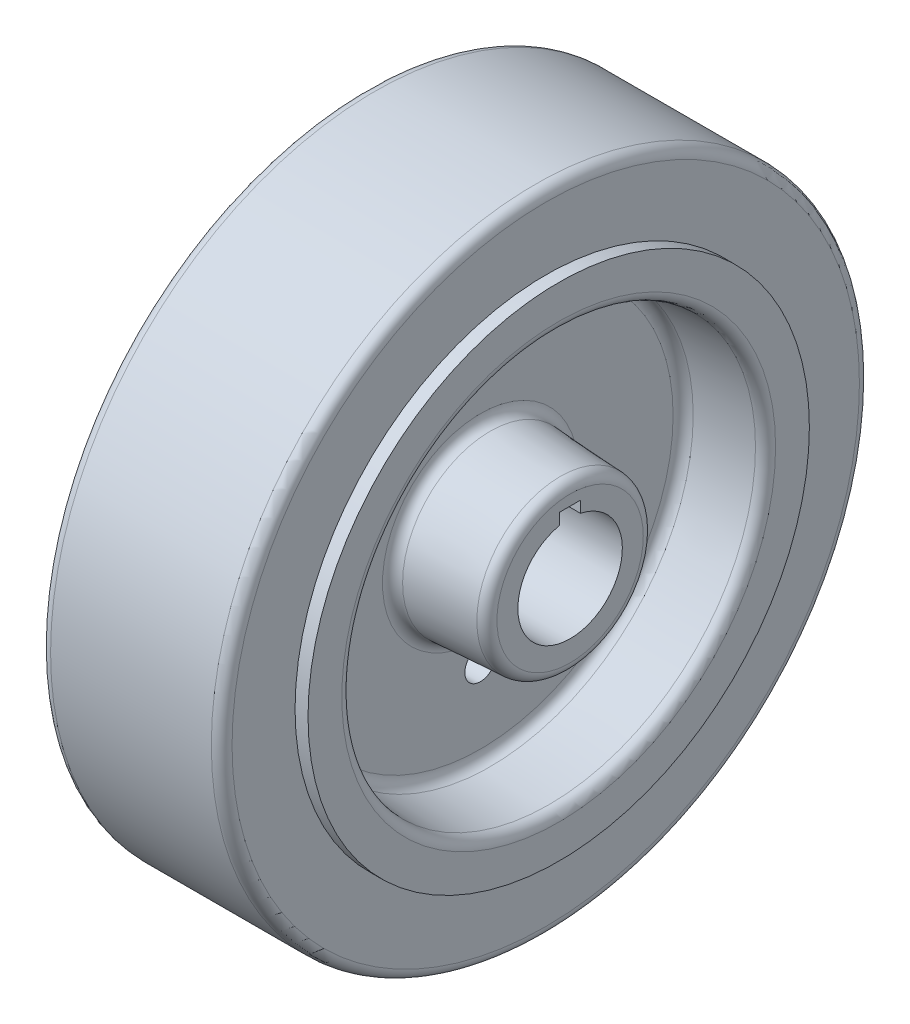
ISO-10303-21;
HEADER;
FILE_DESCRIPTION(('STEP AP214'),'2;1');
FILE_NAME('part.step','',(''),(''),'','','');
FILE_SCHEMA(('AUTOMOTIVE_DESIGN { 1 0 10303 214 1 1 1 1 }'));
ENDSEC;
DATA;
#1=APPLICATION_CONTEXT('core data for automotive mechanical design processes');
#2=APPLICATION_PROTOCOL_DEFINITION('international standard','automotive_design',2000,#1);
#3=PRODUCT_CONTEXT('',#1,'mechanical');
#4=PRODUCT('Part','Part','',(#3));
#5=PRODUCT_RELATED_PRODUCT_CATEGORY('part','',(#4));
#6=PRODUCT_DEFINITION_FORMATION('','',#4);
#7=PRODUCT_DEFINITION_CONTEXT('part definition',#1,'design');
#8=PRODUCT_DEFINITION('design','',#6,#7);
#9=PRODUCT_DEFINITION_SHAPE('','',#8);
#10=(LENGTH_UNIT() NAMED_UNIT(*) SI_UNIT(.MILLI.,.METRE.));
#11=(NAMED_UNIT(*) PLANE_ANGLE_UNIT() SI_UNIT($,.RADIAN.));
#12=(NAMED_UNIT(*) SI_UNIT($,.STERADIAN.) SOLID_ANGLE_UNIT());
#13=UNCERTAINTY_MEASURE_WITH_UNIT(LENGTH_MEASURE(1.E-05),#10,'distance_accuracy_value','');
#14=(GEOMETRIC_REPRESENTATION_CONTEXT(3) GLOBAL_UNCERTAINTY_ASSIGNED_CONTEXT((#13)) GLOBAL_UNIT_ASSIGNED_CONTEXT((#10,
#11,#12)) REPRESENTATION_CONTEXT('',''));
#15=CARTESIAN_POINT('',(0.,0.,0.));
#16=DIRECTION('',(0.,0.,1.));
#17=DIRECTION('',(1.,0.,0.));
#18=AXIS2_PLACEMENT_3D('',#15,#16,#17);
#19=CARTESIAN_POINT('',(17.5,-62.5,0.));
#20=DIRECTION('',(1.,0.,0.));
#21=DIRECTION('',(0.,0.,-1.));
#22=AXIS2_PLACEMENT_3D('',#19,#20,#21);
#23=PLANE('',#22);
#24=CARTESIAN_POINT('',(17.5,0.,0.));
#25=DIRECTION('',(1.,0.,0.));
#26=DIRECTION('',(0.,0.,-1.));
#27=AXIS2_PLACEMENT_3D('',#24,#25,#26);
#28=CIRCLE('',#27,60.5);
#29=CARTESIAN_POINT('',(17.5,0.,-60.5));
#30=VERTEX_POINT('',#29);
#31=EDGE_CURVE('E173',#30,#30,#28,.T.);
#32=ORIENTED_EDGE('',*,*,#31,.T.);
#33=EDGE_LOOP('',(#32));
#34=FACE_BOUND('',#33,.T.);
#35=CARTESIAN_POINT('',(17.5,0.,0.));
#36=DIRECTION('',(-1.,0.,0.));
#37=DIRECTION('',(0.,0.,1.));
#38=AXIS2_PLACEMENT_3D('',#35,#36,#37);
#39=CIRCLE('',#38,48.35);
#40=CARTESIAN_POINT('',(17.5,0.,48.35));
#41=VERTEX_POINT('',#40);
#42=EDGE_CURVE('E111',#41,#41,#39,.T.);
#43=ORIENTED_EDGE('',*,*,#42,.T.);
#44=EDGE_LOOP('',(#43));
#45=FACE_BOUND('',#44,.T.);
#46=ADVANCED_FACE('F39',(#34,#45),#23,.T.);
#47=CARTESIAN_POINT('',(0.,0.,0.));
#48=DIRECTION('',(-1.,0.,0.));
#49=DIRECTION('',(0.,0.,1.));
#50=AXIS2_PLACEMENT_3D('',#47,#48,#49);
#51=CYLINDRICAL_SURFACE('',#50,62.5);
#52=CARTESIAN_POINT('',(-15.5,0.,0.));
#53=DIRECTION('',(-1.,0.,0.));
#54=DIRECTION('',(0.,0.,1.));
#55=AXIS2_PLACEMENT_3D('',#52,#53,#54);
#56=CIRCLE('',#55,62.5);
#57=CARTESIAN_POINT('',(-15.5,0.,62.5));
#58=VERTEX_POINT('',#57);
#59=EDGE_CURVE('E170',#58,#58,#56,.F.);
#60=ORIENTED_EDGE('',*,*,#59,.T.);
#61=EDGE_LOOP('',(#60));
#62=FACE_BOUND('',#61,.T.);
#63=CARTESIAN_POINT('',(15.5,0.,0.));
#64=DIRECTION('',(1.,0.,0.));
#65=DIRECTION('',(0.,0.,-1.));
#66=AXIS2_PLACEMENT_3D('',#63,#64,#65);
#67=CIRCLE('',#66,62.5);
#68=CARTESIAN_POINT('',(15.5,0.,-62.5));
#69=VERTEX_POINT('',#68);
#70=EDGE_CURVE('E167',#69,#69,#67,.F.);
#71=ORIENTED_EDGE('',*,*,#70,.T.);
#72=EDGE_LOOP('',(#71));
#73=FACE_BOUND('',#72,.T.);
#74=ADVANCED_FACE('F202',(#62,#73),#51,.T.);
#75=CARTESIAN_POINT('',(-17.5,-62.5,0.));
#76=DIRECTION('',(-1.,0.,0.));
#77=DIRECTION('',(0.,0.,1.));
#78=AXIS2_PLACEMENT_3D('',#75,#76,#77);
#79=PLANE('',#78);
#80=CARTESIAN_POINT('',(-17.5,0.,0.));
#81=DIRECTION('',(-1.,0.,0.));
#82=DIRECTION('',(0.,0.,1.));
#83=AXIS2_PLACEMENT_3D('',#80,#81,#82);
#84=CIRCLE('',#83,60.5);
#85=CARTESIAN_POINT('',(-17.5,0.,60.5));
#86=VERTEX_POINT('',#85);
#87=EDGE_CURVE('E164',#86,#86,#84,.T.);
#88=ORIENTED_EDGE('',*,*,#87,.T.);
#89=EDGE_LOOP('',(#88));
#90=FACE_BOUND('',#89,.T.);
#91=CARTESIAN_POINT('',(-17.5,0.,0.));
#92=DIRECTION('',(-1.,0.,0.));
#93=DIRECTION('',(0.,0.,1.));
#94=AXIS2_PLACEMENT_3D('',#91,#92,#93);
#95=CIRCLE('',#94,48.35);
#96=CARTESIAN_POINT('',(-17.5,0.,48.35));
#97=VERTEX_POINT('',#96);
#98=EDGE_CURVE('E125',#97,#97,#95,.T.);
#99=ORIENTED_EDGE('',*,*,#98,.F.);
#100=EDGE_LOOP('',(#99));
#101=FACE_BOUND('',#100,.T.);
#102=ADVANCED_FACE('F208',(#90,#101),#79,.T.);
#103=CARTESIAN_POINT('',(0.,0.,0.));
#104=DIRECTION('',(-1.,0.,0.));
#105=DIRECTION('',(0.,0.,1.));
#106=AXIS2_PLACEMENT_3D('',#103,#104,#105);
#107=CYLINDRICAL_SURFACE('',#106,48.35);
#108=ORIENTED_EDGE('',*,*,#98,.T.);
#109=EDGE_LOOP('',(#108));
#110=FACE_BOUND('',#109,.T.);
#111=CARTESIAN_POINT('',(-20.,0.,0.));
#112=DIRECTION('',(-1.,0.,0.));
#113=DIRECTION('',(0.,0.,1.));
#114=AXIS2_PLACEMENT_3D('',#111,#112,#113);
#115=CIRCLE('',#114,48.35);
#116=CARTESIAN_POINT('',(-20.,0.,48.35));
#117=VERTEX_POINT('',#116);
#118=EDGE_CURVE('E122',#117,#117,#115,.T.);
#119=ORIENTED_EDGE('',*,*,#118,.F.);
#120=EDGE_LOOP('',(#119));
#121=FACE_BOUND('',#120,.T.);
#122=ADVANCED_FACE('F264',(#110,#121),#107,.T.);
#123=CARTESIAN_POINT('',(-20.,-48.35,0.));
#124=DIRECTION('',(-1.,0.,0.));
#125=DIRECTION('',(0.,0.,1.));
#126=AXIS2_PLACEMENT_3D('',#123,#124,#125);
#127=PLANE('',#126);
#128=CARTESIAN_POINT('',(-20.,0.,0.));
#129=DIRECTION('',(-1.,0.,0.));
#130=DIRECTION('',(0.,0.,1.));
#131=AXIS2_PLACEMENT_3D('',#128,#129,#130);
#132=CIRCLE('',#131,41.834344028326);
#133=CARTESIAN_POINT('',(-20.,0.,41.834344028326));
#134=VERTEX_POINT('',#133);
#135=EDGE_CURVE('E179',#134,#134,#132,.F.);
#136=ORIENTED_EDGE('',*,*,#135,.T.);
#137=EDGE_LOOP('',(#136));
#138=FACE_BOUND('',#137,.T.);
#139=ORIENTED_EDGE('',*,*,#118,.T.);
#140=EDGE_LOOP('',(#139));
#141=FACE_BOUND('',#140,.T.);
#142=ADVANCED_FACE('F254',(#138,#141),#127,.T.);
#143=CARTESIAN_POINT('',(-4.9,0.,0.));
#144=DIRECTION('',(-1.,0.,0.));
#145=DIRECTION('',(0.,0.,1.));
#146=AXIS2_PLACEMENT_3D('',#143,#144,#145);
#147=CONICAL_SURFACE('',#146,39.05,0.0595322200752487);
#148=CARTESIAN_POINT('',(-6.78100587647518,0.,0.));
#149=DIRECTION('',(-1.,0.,0.));
#150=DIRECTION('',(0.,0.,1.));
#151=AXIS2_PLACEMENT_3D('',#148,#149,#150);
#152=CIRCLE('',#151,39.1621129330349);
#153=CARTESIAN_POINT('',(-6.78100587647518,0.,39.1621129330349));
#154=VERTEX_POINT('',#153);
#155=EDGE_CURVE('E161',#154,#154,#152,.F.);
#156=ORIENTED_EDGE('',*,*,#155,.T.);
#157=EDGE_LOOP('',(#156));
#158=FACE_BOUND('',#157,.T.);
#159=CARTESIAN_POINT('',(-18.1189941235249,0.,0.));
#160=DIRECTION('',(1.,0.,0.));
#161=DIRECTION('',(0.,0.,-1.));
#162=AXIS2_PLACEMENT_3D('',#159,#160,#161);
#163=CIRCLE('',#162,39.8378870669651);
#164=CARTESIAN_POINT('',(-18.1189941235249,0.,-39.8378870669651));
#165=VERTEX_POINT('',#164);
#166=EDGE_CURVE('E158',#165,#165,#163,.F.);
#167=ORIENTED_EDGE('',*,*,#166,.T.);
#168=EDGE_LOOP('',(#167));
#169=FACE_BOUND('',#168,.T.);
#170=ADVANCED_FACE('F251',(#158,#169),#147,.F.);
#171=CARTESIAN_POINT('',(-4.9,-39.05,0.));
#172=DIRECTION('',(-1.,0.,0.));
#173=DIRECTION('',(0.,0.,1.));
#174=AXIS2_PLACEMENT_3D('',#171,#172,#173);
#175=PLANE('',#174);
#176=CARTESIAN_POINT('',(-4.9,-22.8910644094649,0.));
#177=DIRECTION('',(-1.,0.,0.));
#178=DIRECTION('',(0.,0.,1.));
#179=AXIS2_PLACEMENT_3D('',#176,#177,#178);
#180=CIRCLE('',#179,3.);
#181=CARTESIAN_POINT('',(-4.9,-22.8910644094649,-3.));
#182=VERTEX_POINT('',#181);
#183=EDGE_CURVE('E102',#182,#182,#180,.T.);
#184=ORIENTED_EDGE('',*,*,#183,.F.);
#185=EDGE_LOOP('',(#184));
#186=FACE_BOUND('',#185,.T.);
#187=CARTESIAN_POINT('',(-4.9,0.,0.));
#188=DIRECTION('',(-1.,0.,0.));
#189=DIRECTION('',(0.,0.,1.));
#190=AXIS2_PLACEMENT_3D('',#187,#188,#189);
#191=CIRCLE('',#190,18.8877315182009);
#192=CARTESIAN_POINT('',(-4.9,0.,18.8877315182009));
#193=VERTEX_POINT('',#192);
#194=EDGE_CURVE('E155',#193,#193,#191,.F.);
#195=ORIENTED_EDGE('',*,*,#194,.T.);
#196=EDGE_LOOP('',(#195));
#197=FACE_BOUND('',#196,.T.);
#198=CARTESIAN_POINT('',(-4.9,0.,0.));
#199=DIRECTION('',(-1.,0.,0.));
#200=DIRECTION('',(0.,0.,1.));
#201=AXIS2_PLACEMENT_3D('',#198,#199,#200);
#202=CIRCLE('',#201,37.165655971674);
#203=CARTESIAN_POINT('',(-4.9,0.,37.165655971674));
#204=VERTEX_POINT('',#203);
#205=EDGE_CURVE('E152',#204,#204,#202,.T.);
#206=ORIENTED_EDGE('',*,*,#205,.T.);
#207=EDGE_LOOP('',(#206));
#208=FACE_BOUND('',#207,.T.);
#209=ADVANCED_FACE('F253',(#186,#197,#208),#175,.T.);
#210=CARTESIAN_POINT('',(-22.2,0.,0.));
#211=DIRECTION('',(1.,0.,0.));
#212=DIRECTION('',(0.,0.,-1.));
#213=AXIS2_PLACEMENT_3D('',#210,#211,#212);
#214=CONICAL_SURFACE('',#213,16.,0.057739218525104);
#215=CARTESIAN_POINT('',(-6.78458571625803,0.,0.));
#216=DIRECTION('',(1.,0.,0.));
#217=DIRECTION('',(0.,0.,-1.));
#218=AXIS2_PLACEMENT_3D('',#215,#216,#217);
#219=CIRCLE('',#218,16.8910644094649);
#220=CARTESIAN_POINT('',(-6.78458571625803,0.,-16.8910644094649));
#221=VERTEX_POINT('',#220);
#222=EDGE_CURVE('E149',#221,#221,#219,.F.);
#223=ORIENTED_EDGE('',*,*,#222,.T.);
#224=EDGE_LOOP('',(#223));
#225=FACE_BOUND('',#224,.T.);
#226=CARTESIAN_POINT('',(-20.315414283742,0.,0.));
#227=DIRECTION('',(-1.,0.,0.));
#228=DIRECTION('',(0.,0.,1.));
#229=AXIS2_PLACEMENT_3D('',#226,#227,#228);
#230=CIRCLE('',#229,16.1089355905351);
#231=CARTESIAN_POINT('',(-20.315414283742,0.,16.1089355905351));
#232=VERTEX_POINT('',#231);
#233=EDGE_CURVE('E146',#232,#232,#230,.F.);
#234=ORIENTED_EDGE('',*,*,#233,.T.);
#235=EDGE_LOOP('',(#234));
#236=FACE_BOUND('',#235,.T.);
#237=ADVANCED_FACE('F261',(#225,#236),#214,.T.);
#238=CARTESIAN_POINT('',(-22.2,-16.,0.));
#239=DIRECTION('',(-1.,0.,0.));
#240=DIRECTION('',(0.,0.,1.));
#241=AXIS2_PLACEMENT_3D('',#238,#239,#240);
#242=PLANE('',#241);
#243=DIRECTION('',(0.,1.,0.));
#244=VECTOR('',#243,1.);
#245=CARTESIAN_POINT('',(-22.2,12.075,1.99999999999999));
#246=LINE('',#245,#244);
#247=CARTESIAN_POINT('',(-22.2,9.87449365790469,2.));
#248=VERTEX_POINT('',#247);
#249=CARTESIAN_POINT('',(-22.2,12.075,1.99999999999999));
#250=VERTEX_POINT('',#249);
#251=EDGE_CURVE('E97',#248,#250,#246,.T.);
#252=ORIENTED_EDGE('',*,*,#251,.F.);
#253=CARTESIAN_POINT('',(-22.2,0.,0.));
#254=DIRECTION('',(-1.,0.,0.));
#255=DIRECTION('',(0.,0.,1.));
#256=AXIS2_PLACEMENT_3D('',#253,#254,#255);
#257=CIRCLE('',#256,10.075);
#258=CARTESIAN_POINT('',(-22.2,9.87449365790469,-2.));
#259=VERTEX_POINT('',#258);
#260=EDGE_CURVE('E119',#259,#248,#257,.T.);
#261=ORIENTED_EDGE('',*,*,#260,.F.);
#262=DIRECTION('',(0.,-1.,0.));
#263=VECTOR('',#262,1.);
#264=CARTESIAN_POINT('',(-22.2,12.075,-2.00000000000001));
#265=LINE('',#264,#263);
#266=CARTESIAN_POINT('',(-22.2,12.075,-2.00000000000001));
#267=VERTEX_POINT('',#266);
#268=EDGE_CURVE('E99',#267,#259,#265,.T.);
#269=ORIENTED_EDGE('',*,*,#268,.F.);
#270=DIRECTION('',(0.,0.,-1.));
#271=VECTOR('',#270,1.);
#272=CARTESIAN_POINT('',(-22.2,12.075,-2.00000000000001));
#273=LINE('',#272,#271);
#274=EDGE_CURVE('E85',#250,#267,#273,.T.);
#275=ORIENTED_EDGE('',*,*,#274,.F.);
#276=EDGE_LOOP('',(#252,#261,#269,#275));
#277=FACE_BOUND('',#276,.T.);
#278=CARTESIAN_POINT('',(-22.2,0.,0.));
#279=DIRECTION('',(-1.,0.,0.));
#280=DIRECTION('',(0.,0.,1.));
#281=AXIS2_PLACEMENT_3D('',#278,#279,#280);
#282=CIRCLE('',#281,14.1122684817991);
#283=CARTESIAN_POINT('',(-22.2,0.,14.1122684817991));
#284=VERTEX_POINT('',#283);
#285=EDGE_CURVE('E47',#284,#284,#282,.T.);
#286=ORIENTED_EDGE('',*,*,#285,.T.);
#287=EDGE_LOOP('',(#286));
#288=FACE_BOUND('',#287,.T.);
#289=ADVANCED_FACE('F187',(#277,#288),#242,.T.);
#290=CARTESIAN_POINT('',(0.,0.,0.));
#291=DIRECTION('',(-1.,0.,0.));
#292=DIRECTION('',(0.,0.,1.));
#293=AXIS2_PLACEMENT_3D('',#290,#291,#292);
#294=CYLINDRICAL_SURFACE('',#293,10.075);
#295=DIRECTION('',(-1.,0.,0.));
#296=VECTOR('',#295,1.);
#297=CARTESIAN_POINT('',(0.,9.87449365790469,2.));
#298=LINE('',#297,#296);
#299=CARTESIAN_POINT('',(22.2,9.87449365790469,2.));
#300=VERTEX_POINT('',#299);
#301=EDGE_CURVE('E109',#300,#248,#298,.T.);
#302=ORIENTED_EDGE('',*,*,#301,.F.);
#303=CARTESIAN_POINT('',(22.2,0.,0.));
#304=DIRECTION('',(-1.,0.,0.));
#305=DIRECTION('',(0.,0.,1.));
#306=AXIS2_PLACEMENT_3D('',#303,#304,#305);
#307=CIRCLE('',#306,10.075);
#308=CARTESIAN_POINT('',(22.2,9.87449365790469,-2.));
#309=VERTEX_POINT('',#308);
#310=EDGE_CURVE('E117',#309,#300,#307,.T.);
#311=ORIENTED_EDGE('',*,*,#310,.F.);
#312=DIRECTION('',(-1.,0.,0.));
#313=VECTOR('',#312,1.);
#314=CARTESIAN_POINT('',(0.,9.87449365790469,-2.));
#315=LINE('',#314,#313);
#316=EDGE_CURVE('E54',#259,#309,#315,.F.);
#317=ORIENTED_EDGE('',*,*,#316,.F.);
#318=ORIENTED_EDGE('',*,*,#260,.T.);
#319=EDGE_LOOP('',(#302,#311,#317,#318));
#320=FACE_BOUND('',#319,.T.);
#321=ADVANCED_FACE('F426',(#320),#294,.F.);
#322=CARTESIAN_POINT('',(22.2,-16.,0.));
#323=DIRECTION('',(1.,0.,0.));
#324=DIRECTION('',(0.,0.,-1.));
#325=AXIS2_PLACEMENT_3D('',#322,#323,#324);
#326=PLANE('',#325);
#327=DIRECTION('',(0.,-1.,0.));
#328=VECTOR('',#327,1.);
#329=CARTESIAN_POINT('',(22.2,-16.,2.00000000000006));
#330=LINE('',#329,#328);
#331=CARTESIAN_POINT('',(22.2,12.075,1.99999999999999));
#332=VERTEX_POINT('',#331);
#333=EDGE_CURVE('E11',#332,#300,#330,.T.);
#334=ORIENTED_EDGE('',*,*,#333,.F.);
#335=DIRECTION('',(0.,0.,-1.));
#336=VECTOR('',#335,1.);
#337=CARTESIAN_POINT('',(22.2,12.075,-2.00000000000001));
#338=LINE('',#337,#336);
#339=CARTESIAN_POINT('',(22.2,12.075,-2.00000000000001));
#340=VERTEX_POINT('',#339);
#341=EDGE_CURVE('E83',#332,#340,#338,.T.);
#342=ORIENTED_EDGE('',*,*,#341,.T.);
#343=DIRECTION('',(0.,-1.,0.));
#344=VECTOR('',#343,1.);
#345=CARTESIAN_POINT('',(22.2,12.075,-2.00000000000001));
#346=LINE('',#345,#344);
#347=EDGE_CURVE('E88',#340,#309,#346,.T.);
#348=ORIENTED_EDGE('',*,*,#347,.T.);
#349=ORIENTED_EDGE('',*,*,#310,.T.);
#350=EDGE_LOOP('',(#334,#342,#348,#349));
#351=FACE_BOUND('',#350,.T.);
#352=CARTESIAN_POINT('',(22.2,0.,0.));
#353=DIRECTION('',(1.,0.,0.));
#354=DIRECTION('',(0.,0.,-1.));
#355=AXIS2_PLACEMENT_3D('',#352,#353,#354);
#356=CIRCLE('',#355,14.1122684817991);
#357=CARTESIAN_POINT('',(22.2,0.,-14.1122684817991));
#358=VERTEX_POINT('',#357);
#359=EDGE_CURVE('E182',#358,#358,#356,.T.);
#360=ORIENTED_EDGE('',*,*,#359,.T.);
#361=EDGE_LOOP('',(#360));
#362=FACE_BOUND('',#361,.T.);
#363=ADVANCED_FACE('F95',(#351,#362),#326,.T.);
#364=CARTESIAN_POINT('',(4.9,0.,0.));
#365=DIRECTION('',(-1.,0.,0.));
#366=DIRECTION('',(0.,0.,1.));
#367=AXIS2_PLACEMENT_3D('',#364,#365,#366);
#368=CONICAL_SURFACE('',#367,17.,0.057739218525104);
#369=CARTESIAN_POINT('',(6.78458571625803,0.,0.));
#370=DIRECTION('',(-1.,0.,0.));
#371=DIRECTION('',(0.,0.,1.));
#372=AXIS2_PLACEMENT_3D('',#369,#370,#371);
#373=CIRCLE('',#372,16.8910644094649);
#374=CARTESIAN_POINT('',(6.78458571625803,0.,16.8910644094649));
#375=VERTEX_POINT('',#374);
#376=EDGE_CURVE('E143',#375,#375,#373,.F.);
#377=ORIENTED_EDGE('',*,*,#376,.T.);
#378=EDGE_LOOP('',(#377));
#379=FACE_BOUND('',#378,.T.);
#380=CARTESIAN_POINT('',(20.315414283742,0.,0.));
#381=DIRECTION('',(1.,0.,0.));
#382=DIRECTION('',(0.,0.,-1.));
#383=AXIS2_PLACEMENT_3D('',#380,#381,#382);
#384=CIRCLE('',#383,16.1089355905352);
#385=CARTESIAN_POINT('',(20.315414283742,0.,-16.1089355905352));
#386=VERTEX_POINT('',#385);
#387=EDGE_CURVE('E140',#386,#386,#384,.F.);
#388=ORIENTED_EDGE('',*,*,#387,.T.);
#389=EDGE_LOOP('',(#388));
#390=FACE_BOUND('',#389,.T.);
#391=ADVANCED_FACE('F321',(#379,#390),#368,.T.);
#392=CARTESIAN_POINT('',(4.9,-39.05,0.));
#393=DIRECTION('',(1.,0.,0.));
#394=DIRECTION('',(0.,0.,-1.));
#395=AXIS2_PLACEMENT_3D('',#392,#393,#394);
#396=PLANE('',#395);
#397=CARTESIAN_POINT('',(4.9,-22.8910644094649,0.));
#398=DIRECTION('',(1.,0.,0.));
#399=DIRECTION('',(0.,0.,-1.));
#400=AXIS2_PLACEMENT_3D('',#397,#398,#399);
#401=CIRCLE('',#400,3.);
#402=CARTESIAN_POINT('',(4.9,-22.8910644094649,-3.));
#403=VERTEX_POINT('',#402);
#404=EDGE_CURVE('E530',#403,#403,#401,.T.);
#405=ORIENTED_EDGE('',*,*,#404,.F.);
#406=EDGE_LOOP('',(#405));
#407=FACE_BOUND('',#406,.T.);
#408=CARTESIAN_POINT('',(4.9,0.,0.));
#409=DIRECTION('',(1.,0.,0.));
#410=DIRECTION('',(0.,0.,-1.));
#411=AXIS2_PLACEMENT_3D('',#408,#409,#410);
#412=CIRCLE('',#411,37.165655971674);
#413=CARTESIAN_POINT('',(4.9,0.,-37.165655971674));
#414=VERTEX_POINT('',#413);
#415=EDGE_CURVE('E137',#414,#414,#412,.T.);
#416=ORIENTED_EDGE('',*,*,#415,.T.);
#417=EDGE_LOOP('',(#416));
#418=FACE_BOUND('',#417,.T.);
#419=CARTESIAN_POINT('',(4.9,0.,0.));
#420=DIRECTION('',(1.,0.,0.));
#421=DIRECTION('',(0.,0.,-1.));
#422=AXIS2_PLACEMENT_3D('',#419,#420,#421);
#423=CIRCLE('',#422,18.8877315182009);
#424=CARTESIAN_POINT('',(4.9,0.,-18.8877315182009));
#425=VERTEX_POINT('',#424);
#426=EDGE_CURVE('E134',#425,#425,#423,.F.);
#427=ORIENTED_EDGE('',*,*,#426,.T.);
#428=EDGE_LOOP('',(#427));
#429=FACE_BOUND('',#428,.T.);
#430=ADVANCED_FACE('F326',(#407,#418,#429),#396,.T.);
#431=CARTESIAN_POINT('',(20.,0.,0.));
#432=DIRECTION('',(1.,0.,0.));
#433=DIRECTION('',(0.,0.,-1.));
#434=AXIS2_PLACEMENT_3D('',#431,#432,#433);
#435=CONICAL_SURFACE('',#434,39.95,0.0595322200752487);
#436=CARTESIAN_POINT('',(6.78100587647518,0.,0.));
#437=DIRECTION('',(1.,0.,0.));
#438=DIRECTION('',(0.,0.,-1.));
#439=AXIS2_PLACEMENT_3D('',#436,#437,#438);
#440=CIRCLE('',#439,39.1621129330349);
#441=CARTESIAN_POINT('',(6.78100587647518,0.,-39.1621129330349));
#442=VERTEX_POINT('',#441);
#443=EDGE_CURVE('E131',#442,#442,#440,.F.);
#444=ORIENTED_EDGE('',*,*,#443,.T.);
#445=EDGE_LOOP('',(#444));
#446=FACE_BOUND('',#445,.T.);
#447=CARTESIAN_POINT('',(18.1189941235249,0.,0.));
#448=DIRECTION('',(-1.,0.,0.));
#449=DIRECTION('',(0.,0.,1.));
#450=AXIS2_PLACEMENT_3D('',#447,#448,#449);
#451=CIRCLE('',#450,39.8378870669651);
#452=CARTESIAN_POINT('',(18.1189941235249,0.,39.8378870669651));
#453=VERTEX_POINT('',#452);
#454=EDGE_CURVE('E128',#453,#453,#451,.F.);
#455=ORIENTED_EDGE('',*,*,#454,.T.);
#456=EDGE_LOOP('',(#455));
#457=FACE_BOUND('',#456,.T.);
#458=ADVANCED_FACE('F335',(#446,#457),#435,.F.);
#459=CARTESIAN_POINT('',(20.,-48.35,0.));
#460=DIRECTION('',(1.,0.,0.));
#461=DIRECTION('',(0.,0.,-1.));
#462=AXIS2_PLACEMENT_3D('',#459,#460,#461);
#463=PLANE('',#462);
#464=CARTESIAN_POINT('',(20.,0.,0.));
#465=DIRECTION('',(1.,0.,0.));
#466=DIRECTION('',(0.,0.,-1.));
#467=AXIS2_PLACEMENT_3D('',#464,#465,#466);
#468=CIRCLE('',#467,41.834344028326);
#469=CARTESIAN_POINT('',(20.,0.,-41.834344028326));
#470=VERTEX_POINT('',#469);
#471=EDGE_CURVE('E176',#470,#470,#468,.F.);
#472=ORIENTED_EDGE('',*,*,#471,.T.);
#473=EDGE_LOOP('',(#472));
#474=FACE_BOUND('',#473,.T.);
#475=CARTESIAN_POINT('',(20.,0.,0.));
#476=DIRECTION('',(-1.,0.,0.));
#477=DIRECTION('',(0.,0.,1.));
#478=AXIS2_PLACEMENT_3D('',#475,#476,#477);
#479=CIRCLE('',#478,48.35);
#480=CARTESIAN_POINT('',(20.,0.,48.35));
#481=VERTEX_POINT('',#480);
#482=EDGE_CURVE('E114',#481,#481,#479,.T.);
#483=ORIENTED_EDGE('',*,*,#482,.F.);
#484=EDGE_LOOP('',(#483));
#485=FACE_BOUND('',#484,.T.);
#486=ADVANCED_FACE('F340',(#474,#485),#463,.T.);
#487=CARTESIAN_POINT('',(0.,0.,0.));
#488=DIRECTION('',(-1.,0.,0.));
#489=DIRECTION('',(0.,0.,1.));
#490=AXIS2_PLACEMENT_3D('',#487,#488,#489);
#491=CYLINDRICAL_SURFACE('',#490,48.35);
#492=ORIENTED_EDGE('',*,*,#482,.T.);
#493=EDGE_LOOP('',(#492));
#494=FACE_BOUND('',#493,.T.);
#495=ORIENTED_EDGE('',*,*,#42,.F.);
#496=EDGE_LOOP('',(#495));
#497=FACE_BOUND('',#496,.T.);
#498=ADVANCED_FACE('F218',(#494,#497),#491,.T.);
#499=CARTESIAN_POINT('',(6.9,0.,0.));
#500=DIRECTION('',(1.,0.,0.));
#501=DIRECTION('',(0.,0.,-1.));
#502=AXIS2_PLACEMENT_3D('',#499,#500,#501);
#503=TOROIDAL_SURFACE('',#502,37.165655971674,2.);
#504=ORIENTED_EDGE('',*,*,#415,.F.);
#505=EDGE_LOOP('',(#504));
#506=FACE_BOUND('',#505,.T.);
#507=ORIENTED_EDGE('',*,*,#443,.F.);
#508=EDGE_LOOP('',(#507));
#509=FACE_BOUND('',#508,.T.);
#510=ADVANCED_FACE('F214',(#506,#509),#503,.F.);
#511=CARTESIAN_POINT('',(6.9,0.,0.));
#512=DIRECTION('',(1.,0.,0.));
#513=DIRECTION('',(0.,0.,-1.));
#514=AXIS2_PLACEMENT_3D('',#511,#512,#513);
#515=TOROIDAL_SURFACE('',#514,18.8877315182009,2.);
#516=ORIENTED_EDGE('',*,*,#376,.F.);
#517=EDGE_LOOP('',(#516));
#518=FACE_BOUND('',#517,.T.);
#519=ORIENTED_EDGE('',*,*,#426,.F.);
#520=EDGE_LOOP('',(#519));
#521=FACE_BOUND('',#520,.T.);
#522=ADVANCED_FACE('F217',(#518,#521),#515,.F.);
#523=CARTESIAN_POINT('',(-6.9,0.,0.));
#524=DIRECTION('',(-1.,0.,0.));
#525=DIRECTION('',(0.,0.,1.));
#526=AXIS2_PLACEMENT_3D('',#523,#524,#525);
#527=TOROIDAL_SURFACE('',#526,18.8877315182009,2.);
#528=ORIENTED_EDGE('',*,*,#194,.F.);
#529=EDGE_LOOP('',(#528));
#530=FACE_BOUND('',#529,.T.);
#531=ORIENTED_EDGE('',*,*,#222,.F.);
#532=EDGE_LOOP('',(#531));
#533=FACE_BOUND('',#532,.T.);
#534=ADVANCED_FACE('F222',(#530,#533),#527,.F.);
#535=CARTESIAN_POINT('',(-6.9,0.,0.));
#536=DIRECTION('',(-1.,0.,0.));
#537=DIRECTION('',(0.,0.,1.));
#538=AXIS2_PLACEMENT_3D('',#535,#536,#537);
#539=TOROIDAL_SURFACE('',#538,37.165655971674,2.);
#540=ORIENTED_EDGE('',*,*,#155,.F.);
#541=EDGE_LOOP('',(#540));
#542=FACE_BOUND('',#541,.T.);
#543=ORIENTED_EDGE('',*,*,#205,.F.);
#544=EDGE_LOOP('',(#543));
#545=FACE_BOUND('',#544,.T.);
#546=ADVANCED_FACE('F226',(#542,#545),#539,.F.);
#547=CARTESIAN_POINT('',(-15.5,0.,0.));
#548=DIRECTION('',(-1.,0.,0.));
#549=DIRECTION('',(0.,0.,1.));
#550=AXIS2_PLACEMENT_3D('',#547,#548,#549);
#551=TOROIDAL_SURFACE('',#550,60.5,2.);
#552=ORIENTED_EDGE('',*,*,#59,.F.);
#553=EDGE_LOOP('',(#552));
#554=FACE_BOUND('',#553,.T.);
#555=ORIENTED_EDGE('',*,*,#87,.F.);
#556=EDGE_LOOP('',(#555));
#557=FACE_BOUND('',#556,.T.);
#558=ADVANCED_FACE('F230',(#554,#557),#551,.T.);
#559=CARTESIAN_POINT('',(15.5,0.,0.));
#560=DIRECTION('',(1.,0.,0.));
#561=DIRECTION('',(0.,0.,-1.));
#562=AXIS2_PLACEMENT_3D('',#559,#560,#561);
#563=TOROIDAL_SURFACE('',#562,60.5,2.);
#564=ORIENTED_EDGE('',*,*,#31,.F.);
#565=EDGE_LOOP('',(#564));
#566=FACE_BOUND('',#565,.T.);
#567=ORIENTED_EDGE('',*,*,#70,.F.);
#568=EDGE_LOOP('',(#567));
#569=FACE_BOUND('',#568,.T.);
#570=ADVANCED_FACE('F234',(#566,#569),#563,.T.);
#571=CARTESIAN_POINT('',(18.,0.,0.));
#572=DIRECTION('',(1.,0.,0.));
#573=DIRECTION('',(0.,0.,-1.));
#574=AXIS2_PLACEMENT_3D('',#571,#572,#573);
#575=TOROIDAL_SURFACE('',#574,41.834344028326,2.);
#576=ORIENTED_EDGE('',*,*,#454,.F.);
#577=EDGE_LOOP('',(#576));
#578=FACE_BOUND('',#577,.T.);
#579=ORIENTED_EDGE('',*,*,#471,.F.);
#580=EDGE_LOOP('',(#579));
#581=FACE_BOUND('',#580,.T.);
#582=ADVANCED_FACE('F238',(#578,#581),#575,.T.);
#583=CARTESIAN_POINT('',(-18.,0.,0.));
#584=DIRECTION('',(-1.,0.,0.));
#585=DIRECTION('',(0.,0.,1.));
#586=AXIS2_PLACEMENT_3D('',#583,#584,#585);
#587=TOROIDAL_SURFACE('',#586,41.834344028326,2.);
#588=ORIENTED_EDGE('',*,*,#135,.F.);
#589=EDGE_LOOP('',(#588));
#590=FACE_BOUND('',#589,.T.);
#591=ORIENTED_EDGE('',*,*,#166,.F.);
#592=EDGE_LOOP('',(#591));
#593=FACE_BOUND('',#592,.T.);
#594=ADVANCED_FACE('F198',(#590,#593),#587,.T.);
#595=CARTESIAN_POINT('',(20.2,0.,0.));
#596=DIRECTION('',(1.,0.,0.));
#597=DIRECTION('',(0.,0.,-1.));
#598=AXIS2_PLACEMENT_3D('',#595,#596,#597);
#599=TOROIDAL_SURFACE('',#598,14.1122684817991,2.);
#600=ORIENTED_EDGE('',*,*,#359,.F.);
#601=EDGE_LOOP('',(#600));
#602=FACE_BOUND('',#601,.T.);
#603=ORIENTED_EDGE('',*,*,#387,.F.);
#604=EDGE_LOOP('',(#603));
#605=FACE_BOUND('',#604,.T.);
#606=ADVANCED_FACE('F190',(#602,#605),#599,.T.);
#607=CARTESIAN_POINT('',(-20.2,0.,0.));
#608=DIRECTION('',(-1.,0.,0.));
#609=DIRECTION('',(0.,0.,1.));
#610=AXIS2_PLACEMENT_3D('',#607,#608,#609);
#611=TOROIDAL_SURFACE('',#610,14.1122684817991,2.);
#612=ORIENTED_EDGE('',*,*,#233,.F.);
#613=EDGE_LOOP('',(#612));
#614=FACE_BOUND('',#613,.T.);
#615=ORIENTED_EDGE('',*,*,#285,.F.);
#616=EDGE_LOOP('',(#615));
#617=FACE_BOUND('',#616,.T.);
#618=ADVANCED_FACE('F41',(#614,#617),#611,.T.);
#619=CARTESIAN_POINT('',(22.2,12.075,-2.00000000000001));
#620=DIRECTION('',(0.,1.,0.));
#621=DIRECTION('',(0.,0.,1.));
#622=AXIS2_PLACEMENT_3D('',#619,#620,#621);
#623=PLANE('',#622);
#624=ORIENTED_EDGE('',*,*,#274,.T.);
#625=DIRECTION('',(-1.,0.,0.));
#626=VECTOR('',#625,1.);
#627=CARTESIAN_POINT('',(22.2,12.075,-2.00000000000001));
#628=LINE('',#627,#626);
#629=EDGE_CURVE('E79',#340,#267,#628,.T.);
#630=ORIENTED_EDGE('',*,*,#629,.F.);
#631=ORIENTED_EDGE('',*,*,#341,.F.);
#632=DIRECTION('',(-1.,0.,0.));
#633=VECTOR('',#632,1.);
#634=CARTESIAN_POINT('',(22.2,12.075,1.99999999999999));
#635=LINE('',#634,#633);
#636=EDGE_CURVE('E87',#332,#250,#635,.T.);
#637=ORIENTED_EDGE('',*,*,#636,.T.);
#638=EDGE_LOOP('',(#624,#630,#631,#637));
#639=FACE_BOUND('',#638,.T.);
#640=ADVANCED_FACE('F80',(#639),#623,.F.);
#641=CARTESIAN_POINT('',(22.2,12.075,1.99999999999999));
#642=DIRECTION('',(0.,0.,1.));
#643=DIRECTION('',(0.,-1.,0.));
#644=AXIS2_PLACEMENT_3D('',#641,#642,#643);
#645=PLANE('',#644);
#646=ORIENTED_EDGE('',*,*,#301,.T.);
#647=ORIENTED_EDGE('',*,*,#251,.T.);
#648=ORIENTED_EDGE('',*,*,#636,.F.);
#649=ORIENTED_EDGE('',*,*,#333,.T.);
#650=EDGE_LOOP('',(#646,#647,#648,#649));
#651=FACE_BOUND('',#650,.T.);
#652=ADVANCED_FACE('F196',(#651),#645,.F.);
#653=CARTESIAN_POINT('',(22.2,12.075,-2.00000000000001));
#654=DIRECTION('',(0.,0.,-1.));
#655=DIRECTION('',(0.,1.,0.));
#656=AXIS2_PLACEMENT_3D('',#653,#654,#655);
#657=PLANE('',#656);
#658=ORIENTED_EDGE('',*,*,#316,.T.);
#659=ORIENTED_EDGE('',*,*,#347,.F.);
#660=ORIENTED_EDGE('',*,*,#629,.T.);
#661=ORIENTED_EDGE('',*,*,#268,.T.);
#662=EDGE_LOOP('',(#658,#659,#660,#661));
#663=FACE_BOUND('',#662,.T.);
#664=ADVANCED_FACE('F90',(#663),#657,.F.);
#665=CARTESIAN_POINT('',(-22.2,-22.8910644094649,0.));
#666=DIRECTION('',(1.,0.,0.));
#667=DIRECTION('',(0.,0.,-1.));
#668=AXIS2_PLACEMENT_3D('',#665,#666,#667);
#669=CYLINDRICAL_SURFACE('',#668,3.);
#670=CARTESIAN_POINT('',(-4.9,-22.8910644094649,-3.));
#671=CARTESIAN_POINT('',(-4.79791666666667,-22.8910644094649,-3.));
#672=CARTESIAN_POINT('',(-4.69583333333333,-22.8910644094649,-3.));
#673=CARTESIAN_POINT('',(-4.49166666666667,-22.8910644094649,-3.));
#674=CARTESIAN_POINT('',(-4.38958333333333,-22.8910644094649,-3.));
#675=CARTESIAN_POINT('',(-4.18541666666667,-22.8910644094649,-3.));
#676=CARTESIAN_POINT('',(-4.08333333333333,-22.8910644094649,-3.));
#677=CARTESIAN_POINT('',(-3.87916666666667,-22.8910644094649,-3.));
#678=CARTESIAN_POINT('',(-3.77708333333333,-22.8910644094649,-3.));
#679=CARTESIAN_POINT('',(-3.57291666666667,-22.8910644094649,-3.));
#680=CARTESIAN_POINT('',(-3.47083333333333,-22.8910644094649,-3.));
#681=CARTESIAN_POINT('',(-3.26666666666667,-22.8910644094649,-3.));
#682=CARTESIAN_POINT('',(-3.16458333333334,-22.8910644094649,-3.));
#683=CARTESIAN_POINT('',(-2.96041666666667,-22.8910644094649,-3.));
#684=CARTESIAN_POINT('',(-2.85833333333334,-22.8910644094649,-3.));
#685=CARTESIAN_POINT('',(-2.65416666666667,-22.8910644094649,-3.));
#686=CARTESIAN_POINT('',(-2.55208333333333,-22.8910644094649,-3.));
#687=CARTESIAN_POINT('',(-2.34791666666667,-22.8910644094649,-3.));
#688=CARTESIAN_POINT('',(-2.24583333333333,-22.8910644094649,-3.));
#689=CARTESIAN_POINT('',(-2.04166666666667,-22.8910644094649,-3.));
#690=CARTESIAN_POINT('',(-1.93958333333333,-22.8910644094649,-3.));
#691=CARTESIAN_POINT('',(-1.73541666666667,-22.8910644094649,-3.));
#692=CARTESIAN_POINT('',(-1.63333333333333,-22.8910644094649,-3.));
#693=CARTESIAN_POINT('',(-1.42916666666667,-22.8910644094649,-3.));
#694=CARTESIAN_POINT('',(-1.32708333333333,-22.8910644094649,-3.));
#695=CARTESIAN_POINT('',(-1.12291666666667,-22.8910644094649,-3.));
#696=CARTESIAN_POINT('',(-1.02083333333333,-22.8910644094649,-3.));
#697=CARTESIAN_POINT('',(-0.816666666666667,-22.8910644094649,-3.));
#698=CARTESIAN_POINT('',(-0.714583333333334,-22.8910644094649,-3.));
#699=CARTESIAN_POINT('',(-0.510416666666668,-22.8910644094649,-3.));
#700=CARTESIAN_POINT('',(-0.408333333333335,-22.8910644094649,-3.));
#701=CARTESIAN_POINT('',(-0.204166666666667,-22.8910644094649,-3.));
#702=CARTESIAN_POINT('',(-0.102083333333334,-22.8910644094649,-3.));
#703=CARTESIAN_POINT('',(0.102083333333334,-22.8910644094649,-3.));
#704=CARTESIAN_POINT('',(0.204166666666667,-22.8910644094649,-3.));
#705=CARTESIAN_POINT('',(0.408333333333335,-22.8910644094649,-3.));
#706=CARTESIAN_POINT('',(0.510416666666668,-22.8910644094649,-3.));
#707=CARTESIAN_POINT('',(0.714583333333334,-22.8910644094649,-3.));
#708=CARTESIAN_POINT('',(0.816666666666667,-22.8910644094649,-3.));
#709=CARTESIAN_POINT('',(1.02083333333333,-22.8910644094649,-3.));
#710=CARTESIAN_POINT('',(1.12291666666667,-22.8910644094649,-3.));
#711=CARTESIAN_POINT('',(1.32708333333333,-22.8910644094649,-3.));
#712=CARTESIAN_POINT('',(1.42916666666667,-22.8910644094649,-3.));
#713=CARTESIAN_POINT('',(1.63333333333333,-22.8910644094649,-3.));
#714=CARTESIAN_POINT('',(1.73541666666667,-22.8910644094649,-3.));
#715=CARTESIAN_POINT('',(1.93958333333333,-22.8910644094649,-3.));
#716=CARTESIAN_POINT('',(2.04166666666667,-22.8910644094649,-3.));
#717=CARTESIAN_POINT('',(2.24583333333333,-22.8910644094649,-3.));
#718=CARTESIAN_POINT('',(2.34791666666667,-22.8910644094649,-3.));
#719=CARTESIAN_POINT('',(2.55208333333333,-22.8910644094649,-3.));
#720=CARTESIAN_POINT('',(2.65416666666667,-22.8910644094649,-3.));
#721=CARTESIAN_POINT('',(2.85833333333334,-22.8910644094649,-3.));
#722=CARTESIAN_POINT('',(2.96041666666667,-22.8910644094649,-3.));
#723=CARTESIAN_POINT('',(3.16458333333334,-22.8910644094649,-3.));
#724=CARTESIAN_POINT('',(3.26666666666667,-22.8910644094649,-3.));
#725=CARTESIAN_POINT('',(3.47083333333333,-22.8910644094649,-3.));
#726=CARTESIAN_POINT('',(3.57291666666667,-22.8910644094649,-3.));
#727=CARTESIAN_POINT('',(3.77708333333333,-22.8910644094649,-3.));
#728=CARTESIAN_POINT('',(3.87916666666667,-22.8910644094649,-3.));
#729=CARTESIAN_POINT('',(4.08333333333333,-22.8910644094649,-3.));
#730=CARTESIAN_POINT('',(4.18541666666667,-22.8910644094649,-3.));
#731=CARTESIAN_POINT('',(4.38958333333333,-22.8910644094649,-3.));
#732=CARTESIAN_POINT('',(4.49166666666667,-22.8910644094649,-3.));
#733=CARTESIAN_POINT('',(4.69583333333333,-22.8910644094649,-3.));
#734=CARTESIAN_POINT('',(4.79791666666667,-22.8910644094649,-3.));
#735=CARTESIAN_POINT('',(4.9,-22.8910644094649,-3.));
#736=B_SPLINE_CURVE_WITH_KNOTS('',3,(#670,#671,#672,#673,#674,#675,#676,#677,#678,#679,#680,
#681,#682,#683,#684,#685,#686,#687,#688,#689,#690,#691,#692,#693,#694,#695,#696,#697,#698,#699,
#700,#701,#702,#703,#704,#705,#706,#707,#708,#709,#710,#711,#712,#713,#714,#715,#716,#717,#718,
#719,#720,#721,#722,#723,#724,#725,#726,#727,#728,#729,#730,#731,#732,#733,#734,#735),
.UNSPECIFIED.,.F.,.F.,(4,2,2,2,2,2,2,2,2,2,2,2,2,2,2,2,2,2,2,2,2,2,2,2,2,2,2,2,2,2,2,2,4),(0.,
0.306250000000001,0.612500000000002,0.918749999999999,1.225,1.53125,1.8375,2.14375,2.45,2.75625,
3.0625,3.36875,3.675,3.98125,4.2875,4.59375,4.9,5.20625,5.5125,5.81875,6.125,6.43125,6.7375,
7.04375,7.35,7.65625,7.9625,8.26875,8.575,8.88125,9.1875,9.49375,9.8),.UNSPECIFIED.);
#737=EDGE_CURVE('BSEAM467',#182,#403,#736,.T.);
#738=ORIENTED_EDGE('',*,*,#183,.T.);
#739=ORIENTED_EDGE('',*,*,#404,.T.);
#740=ORIENTED_EDGE('',*,*,#737,.T.);
#741=ORIENTED_EDGE('',*,*,#737,.F.);
#742=EDGE_LOOP('',(#738,#740,#739,#741));
#743=FACE_BOUND('',#742,.T.);
#744=ADVANCED_FACE('F467',(#743),#669,.F.);
#745=CLOSED_SHELL('',(#46,#74,#102,#122,#142,#170,#209,#237,#289,#321,#363,#391,#430,#458,#486,
#498,#510,#522,#534,#546,#558,#570,#582,#594,#606,#618,#640,#652,#664,#744));
#746=MANIFOLD_SOLID_BREP('B2',#745);
#747=ADVANCED_BREP_SHAPE_REPRESENTATION('',(#18,#746),#14);
#748=SHAPE_DEFINITION_REPRESENTATION(#9,#747);
ENDSEC;
END-ISO-10303-21;
